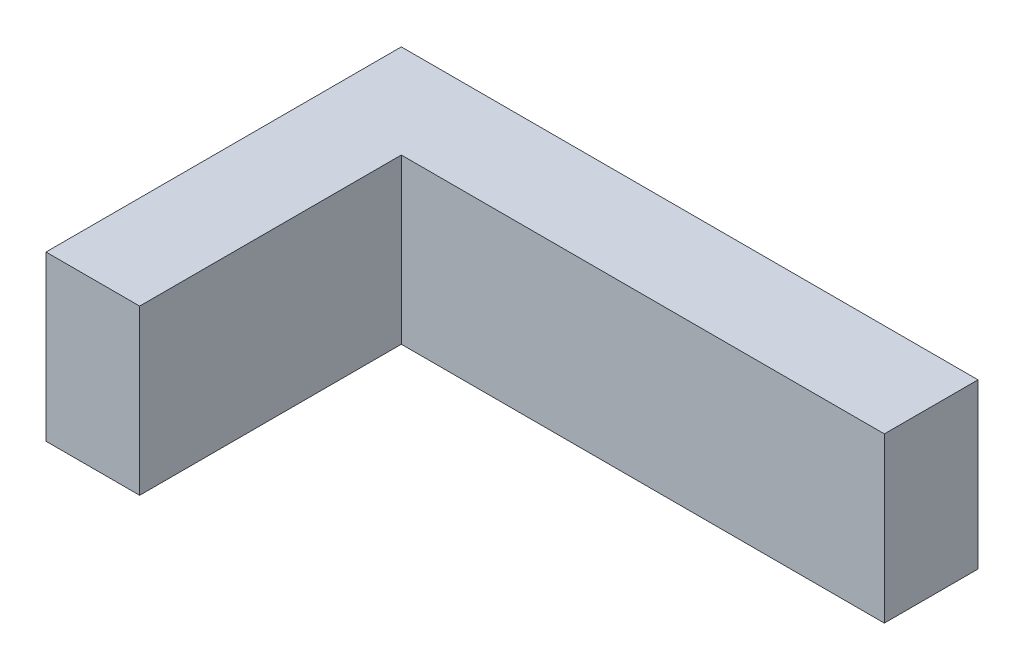
ISO-10303-21;
HEADER;
FILE_DESCRIPTION(('STEP AP214'),'2;1');
FILE_NAME('part.step','',(''),(''),'','','');
FILE_SCHEMA(('AUTOMOTIVE_DESIGN { 1 0 10303 214 1 1 1 1 }'));
ENDSEC;
DATA;
#1=APPLICATION_CONTEXT('core data for automotive mechanical design processes');
#2=APPLICATION_PROTOCOL_DEFINITION('international standard','automotive_design',2000,#1);
#3=PRODUCT_CONTEXT('',#1,'mechanical');
#4=PRODUCT('Part','Part','',(#3));
#5=PRODUCT_RELATED_PRODUCT_CATEGORY('part','',(#4));
#6=PRODUCT_DEFINITION_FORMATION('','',#4);
#7=PRODUCT_DEFINITION_CONTEXT('part definition',#1,'design');
#8=PRODUCT_DEFINITION('design','',#6,#7);
#9=PRODUCT_DEFINITION_SHAPE('','',#8);
#10=(LENGTH_UNIT() NAMED_UNIT(*) SI_UNIT(.MILLI.,.METRE.));
#11=(NAMED_UNIT(*) PLANE_ANGLE_UNIT() SI_UNIT($,.RADIAN.));
#12=(NAMED_UNIT(*) SI_UNIT($,.STERADIAN.) SOLID_ANGLE_UNIT());
#13=UNCERTAINTY_MEASURE_WITH_UNIT(LENGTH_MEASURE(1.E-05),#10,'distance_accuracy_value','');
#14=(GEOMETRIC_REPRESENTATION_CONTEXT(3) GLOBAL_UNCERTAINTY_ASSIGNED_CONTEXT((#13)) GLOBAL_UNIT_ASSIGNED_CONTEXT((#10,
#11,#12)) REPRESENTATION_CONTEXT('',''));
#15=CARTESIAN_POINT('',(0.,0.,0.));
#16=DIRECTION('',(0.,0.,1.));
#17=DIRECTION('',(1.,0.,0.));
#18=AXIS2_PLACEMENT_3D('',#15,#16,#17);
#19=CARTESIAN_POINT('',(90.2035496226668,8.5,-94.8012846604851));
#20=DIRECTION('',(0.,0.,1.));
#21=DIRECTION('',(1.,0.,0.));
#22=AXIS2_PLACEMENT_3D('',#19,#20,#21);
#23=PLANE('',#22);
#24=DIRECTION('',(-1.,0.,0.));
#25=VECTOR('',#24,1.);
#26=CARTESIAN_POINT('',(90.2035496226668,1.5,-94.8012846604851));
#27=LINE('',#26,#25);
#28=CARTESIAN_POINT('',(114.833141635867,1.5,-94.8012846604851));
#29=VERTEX_POINT('',#28);
#30=CARTESIAN_POINT('',(90.2035496226668,1.5,-94.8012846604851));
#31=VERTEX_POINT('',#30);
#32=EDGE_CURVE('E100',#29,#31,#27,.T.);
#33=ORIENTED_EDGE('',*,*,#32,.T.);
#34=DIRECTION('',(0.,-1.,0.));
#35=VECTOR('',#34,1.);
#36=CARTESIAN_POINT('',(90.2035496226668,8.5,-94.8012846604851));
#37=LINE('',#36,#35);
#38=CARTESIAN_POINT('',(90.2035496226668,8.5,-94.8012846604851));
#39=VERTEX_POINT('',#38);
#40=EDGE_CURVE('E11',#39,#31,#37,.T.);
#41=ORIENTED_EDGE('',*,*,#40,.F.);
#42=DIRECTION('',(-1.,0.,0.));
#43=VECTOR('',#42,1.);
#44=CARTESIAN_POINT('',(90.2035496226668,8.5,-94.8012846604851));
#45=LINE('',#44,#43);
#46=CARTESIAN_POINT('',(114.833141635867,8.5,-94.8012846604851));
#47=VERTEX_POINT('',#46);
#48=EDGE_CURVE('E103',#47,#39,#45,.T.);
#49=ORIENTED_EDGE('',*,*,#48,.F.);
#50=DIRECTION('',(0.,-1.,0.));
#51=VECTOR('',#50,1.);
#52=CARTESIAN_POINT('',(114.833141635867,8.5,-94.8012846604851));
#53=LINE('',#52,#51);
#54=EDGE_CURVE('E111',#47,#29,#53,.T.);
#55=ORIENTED_EDGE('',*,*,#54,.T.);
#56=EDGE_LOOP('',(#33,#41,#49,#55));
#57=FACE_BOUND('',#56,.T.);
#58=ADVANCED_FACE('F45',(#57),#23,.F.);
#59=CARTESIAN_POINT('',(90.2035496226668,8.5,-79.6254921336125));
#60=DIRECTION('',(1.,0.,0.));
#61=DIRECTION('',(0.,0.,-1.));
#62=AXIS2_PLACEMENT_3D('',#59,#60,#61);
#63=PLANE('',#62);
#64=DIRECTION('',(0.,0.,1.));
#65=VECTOR('',#64,1.);
#66=CARTESIAN_POINT('',(90.2035496226668,1.5,-79.6254921336125));
#67=LINE('',#66,#65);
#68=CARTESIAN_POINT('',(90.2035496226668,1.5,-79.6254921336125));
#69=VERTEX_POINT('',#68);
#70=EDGE_CURVE('E138',#31,#69,#67,.T.);
#71=ORIENTED_EDGE('',*,*,#70,.T.);
#72=DIRECTION('',(0.,-1.,0.));
#73=VECTOR('',#72,1.);
#74=CARTESIAN_POINT('',(90.2035496226668,8.5,-79.6254921336125));
#75=LINE('',#74,#73);
#76=CARTESIAN_POINT('',(90.2035496226668,8.5,-79.6254921336125));
#77=VERTEX_POINT('',#76);
#78=EDGE_CURVE('E53',#77,#69,#75,.T.);
#79=ORIENTED_EDGE('',*,*,#78,.F.);
#80=DIRECTION('',(0.,0.,1.));
#81=VECTOR('',#80,1.);
#82=CARTESIAN_POINT('',(90.2035496226668,8.5,-79.6254921336125));
#83=LINE('',#82,#81);
#84=EDGE_CURVE('E137',#39,#77,#83,.T.);
#85=ORIENTED_EDGE('',*,*,#84,.F.);
#86=ORIENTED_EDGE('',*,*,#40,.T.);
#87=EDGE_LOOP('',(#71,#79,#85,#86));
#88=FACE_BOUND('',#87,.T.);
#89=ADVANCED_FACE('F136',(#88),#63,.F.);
#90=CARTESIAN_POINT('',(94.2035496226668,8.5,-79.6254921336125));
#91=DIRECTION('',(0.,0.,-1.));
#92=DIRECTION('',(-1.,0.,0.));
#93=AXIS2_PLACEMENT_3D('',#90,#91,#92);
#94=PLANE('',#93);
#95=DIRECTION('',(1.,0.,0.));
#96=VECTOR('',#95,1.);
#97=CARTESIAN_POINT('',(94.2035496226668,1.5,-79.6254921336125));
#98=LINE('',#97,#96);
#99=CARTESIAN_POINT('',(94.2035496226668,1.5,-79.6254921336125));
#100=VERTEX_POINT('',#99);
#101=EDGE_CURVE('E118',#69,#100,#98,.T.);
#102=ORIENTED_EDGE('',*,*,#101,.T.);
#103=DIRECTION('',(0.,-1.,0.));
#104=VECTOR('',#103,1.);
#105=CARTESIAN_POINT('',(94.2035496226668,8.5,-79.6254921336125));
#106=LINE('',#105,#104);
#107=CARTESIAN_POINT('',(94.2035496226668,8.5,-79.6254921336125));
#108=VERTEX_POINT('',#107);
#109=EDGE_CURVE('E124',#108,#100,#106,.T.);
#110=ORIENTED_EDGE('',*,*,#109,.F.);
#111=DIRECTION('',(1.,0.,0.));
#112=VECTOR('',#111,1.);
#113=CARTESIAN_POINT('',(94.2035496226668,8.5,-79.6254921336125));
#114=LINE('',#113,#112);
#115=EDGE_CURVE('E133',#77,#108,#114,.T.);
#116=ORIENTED_EDGE('',*,*,#115,.F.);
#117=ORIENTED_EDGE('',*,*,#78,.T.);
#118=EDGE_LOOP('',(#102,#110,#116,#117));
#119=FACE_BOUND('',#118,.T.);
#120=ADVANCED_FACE('F131',(#119),#94,.F.);
#121=CARTESIAN_POINT('',(94.2035496226668,8.5,-90.8012846604851));
#122=DIRECTION('',(-1.,0.,0.));
#123=DIRECTION('',(0.,0.,1.));
#124=AXIS2_PLACEMENT_3D('',#121,#122,#123);
#125=PLANE('',#124);
#126=DIRECTION('',(0.,0.,-1.));
#127=VECTOR('',#126,1.);
#128=CARTESIAN_POINT('',(94.2035496226668,1.5,-90.8012846604851));
#129=LINE('',#128,#127);
#130=CARTESIAN_POINT('',(94.2035496226668,1.5,-90.8012846604851));
#131=VERTEX_POINT('',#130);
#132=EDGE_CURVE('E116',#100,#131,#129,.T.);
#133=ORIENTED_EDGE('',*,*,#132,.T.);
#134=DIRECTION('',(0.,-1.,0.));
#135=VECTOR('',#134,1.);
#136=CARTESIAN_POINT('',(94.2035496226668,8.5,-90.8012846604851));
#137=LINE('',#136,#135);
#138=CARTESIAN_POINT('',(94.2035496226668,8.5,-90.8012846604851));
#139=VERTEX_POINT('',#138);
#140=EDGE_CURVE('E110',#139,#131,#137,.T.);
#141=ORIENTED_EDGE('',*,*,#140,.F.);
#142=DIRECTION('',(0.,0.,-1.));
#143=VECTOR('',#142,1.);
#144=CARTESIAN_POINT('',(94.2035496226668,8.5,-90.8012846604851));
#145=LINE('',#144,#143);
#146=EDGE_CURVE('E146',#108,#139,#145,.T.);
#147=ORIENTED_EDGE('',*,*,#146,.F.);
#148=ORIENTED_EDGE('',*,*,#109,.T.);
#149=EDGE_LOOP('',(#133,#141,#147,#148));
#150=FACE_BOUND('',#149,.T.);
#151=ADVANCED_FACE('F161',(#150),#125,.F.);
#152=CARTESIAN_POINT('',(114.833141635867,8.5,-90.8012846604851));
#153=DIRECTION('',(0.,0.,-1.));
#154=DIRECTION('',(-1.,0.,0.));
#155=AXIS2_PLACEMENT_3D('',#152,#153,#154);
#156=PLANE('',#155);
#157=DIRECTION('',(1.,0.,0.));
#158=VECTOR('',#157,1.);
#159=CARTESIAN_POINT('',(114.833141635867,1.5,-90.8012846604851));
#160=LINE('',#159,#158);
#161=CARTESIAN_POINT('',(114.833141635867,1.5,-90.8012846604851));
#162=VERTEX_POINT('',#161);
#163=EDGE_CURVE('E97',#131,#162,#160,.T.);
#164=ORIENTED_EDGE('',*,*,#163,.T.);
#165=DIRECTION('',(0.,-1.,0.));
#166=VECTOR('',#165,1.);
#167=CARTESIAN_POINT('',(114.833141635867,8.5,-90.8012846604851));
#168=LINE('',#167,#166);
#169=CARTESIAN_POINT('',(114.833141635867,8.5,-90.8012846604851));
#170=VERTEX_POINT('',#169);
#171=EDGE_CURVE('E106',#170,#162,#168,.T.);
#172=ORIENTED_EDGE('',*,*,#171,.F.);
#173=DIRECTION('',(1.,0.,0.));
#174=VECTOR('',#173,1.);
#175=CARTESIAN_POINT('',(114.833141635867,8.5,-90.8012846604851));
#176=LINE('',#175,#174);
#177=EDGE_CURVE('E144',#139,#170,#176,.T.);
#178=ORIENTED_EDGE('',*,*,#177,.F.);
#179=ORIENTED_EDGE('',*,*,#140,.T.);
#180=EDGE_LOOP('',(#164,#172,#178,#179));
#181=FACE_BOUND('',#180,.T.);
#182=ADVANCED_FACE('F114',(#181),#156,.F.);
#183=CARTESIAN_POINT('',(114.833141635867,8.5,-94.8012846604851));
#184=DIRECTION('',(-1.,0.,0.));
#185=DIRECTION('',(0.,0.,1.));
#186=AXIS2_PLACEMENT_3D('',#183,#184,#185);
#187=PLANE('',#186);
#188=DIRECTION('',(0.,0.,-1.));
#189=VECTOR('',#188,1.);
#190=CARTESIAN_POINT('',(114.833141635867,1.5,-94.8012846604851));
#191=LINE('',#190,#189);
#192=EDGE_CURVE('E93',#162,#29,#191,.T.);
#193=ORIENTED_EDGE('',*,*,#192,.T.);
#194=ORIENTED_EDGE('',*,*,#54,.F.);
#195=DIRECTION('',(0.,0.,-1.));
#196=VECTOR('',#195,1.);
#197=CARTESIAN_POINT('',(114.833141635867,8.5,-94.8012846604851));
#198=LINE('',#197,#196);
#199=EDGE_CURVE('E60',#170,#47,#198,.T.);
#200=ORIENTED_EDGE('',*,*,#199,.F.);
#201=ORIENTED_EDGE('',*,*,#171,.T.);
#202=EDGE_LOOP('',(#193,#194,#200,#201));
#203=FACE_BOUND('',#202,.T.);
#204=ADVANCED_FACE('F107',(#203),#187,.F.);
#205=CARTESIAN_POINT('',(0.,8.5,0.));
#206=DIRECTION('',(0.,-1.,0.));
#207=DIRECTION('',(0.,0.,-1.));
#208=AXIS2_PLACEMENT_3D('',#205,#206,#207);
#209=PLANE('',#208);
#210=ORIENTED_EDGE('',*,*,#48,.T.);
#211=ORIENTED_EDGE('',*,*,#84,.T.);
#212=ORIENTED_EDGE('',*,*,#115,.T.);
#213=ORIENTED_EDGE('',*,*,#146,.T.);
#214=ORIENTED_EDGE('',*,*,#177,.T.);
#215=ORIENTED_EDGE('',*,*,#199,.T.);
#216=EDGE_LOOP('',(#210,#211,#212,#213,#214,#215));
#217=FACE_BOUND('',#216,.T.);
#218=ADVANCED_FACE('F151',(#217),#209,.F.);
#219=CARTESIAN_POINT('',(116.590206445028,1.5,-98.8767147234045));
#220=DIRECTION('',(0.,1.,0.));
#221=DIRECTION('',(0.,0.,1.));
#222=AXIS2_PLACEMENT_3D('',#219,#220,#221);
#223=PLANE('',#222);
#224=ORIENTED_EDGE('',*,*,#192,.F.);
#225=ORIENTED_EDGE('',*,*,#163,.F.);
#226=ORIENTED_EDGE('',*,*,#132,.F.);
#227=ORIENTED_EDGE('',*,*,#101,.F.);
#228=ORIENTED_EDGE('',*,*,#70,.F.);
#229=ORIENTED_EDGE('',*,*,#32,.F.);
#230=EDGE_LOOP('',(#224,#225,#226,#227,#228,#229));
#231=FACE_BOUND('',#230,.T.);
#232=ADVANCED_FACE('F95',(#231),#223,.F.);
#233=CLOSED_SHELL('',(#58,#89,#120,#151,#182,#204,#218,#232));
#234=MANIFOLD_SOLID_BREP('B2',#233);
#235=ADVANCED_BREP_SHAPE_REPRESENTATION('',(#18,#234),#14);
#236=SHAPE_DEFINITION_REPRESENTATION(#9,#235);
ENDSEC;
END-ISO-10303-21;
